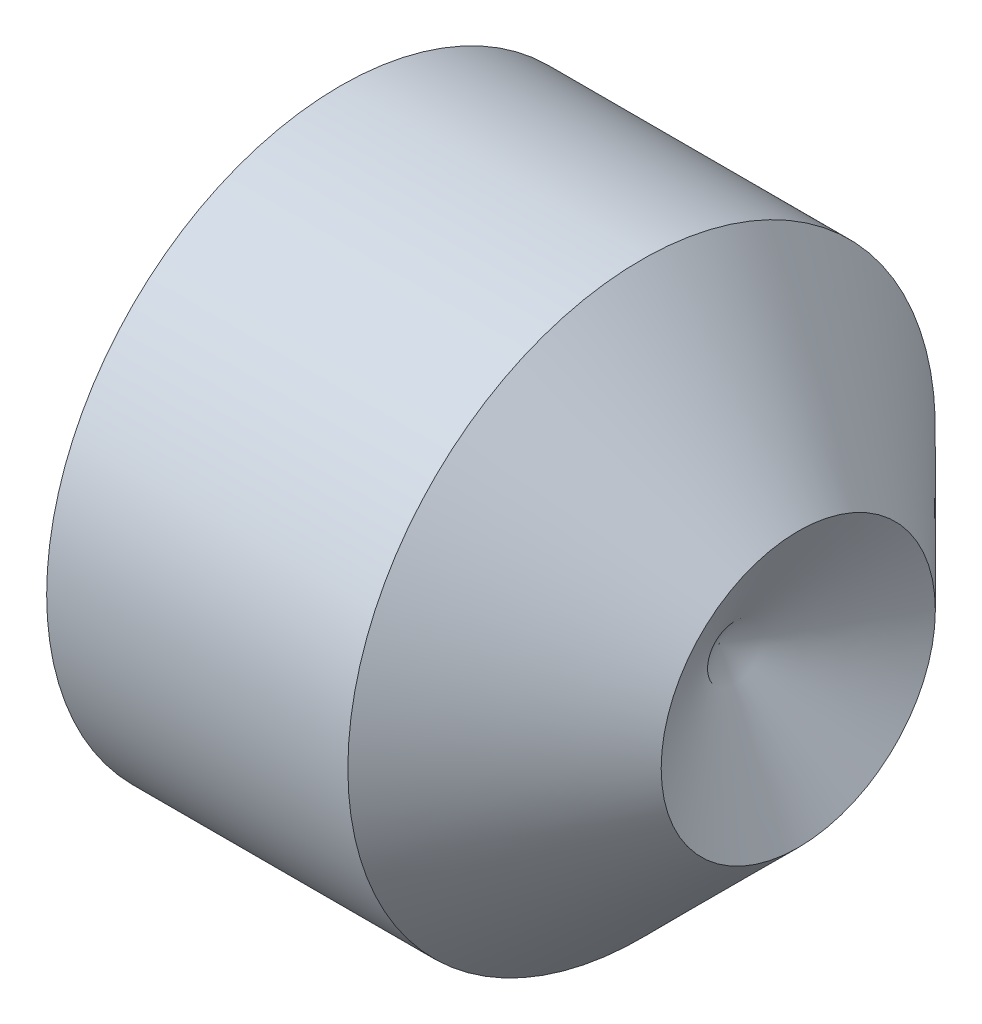
ISO-10303-21;
HEADER;
FILE_DESCRIPTION(('STEP AP214'),'2;1');
FILE_NAME('part.step','',(''),(''),'','','');
FILE_SCHEMA(('AUTOMOTIVE_DESIGN { 1 0 10303 214 1 1 1 1 }'));
ENDSEC;
DATA;
#1=APPLICATION_CONTEXT('core data for automotive mechanical design processes');
#2=APPLICATION_PROTOCOL_DEFINITION('international standard','automotive_design',2000,#1);
#3=PRODUCT_CONTEXT('',#1,'mechanical');
#4=PRODUCT('Part','Part','',(#3));
#5=PRODUCT_RELATED_PRODUCT_CATEGORY('part','',(#4));
#6=PRODUCT_DEFINITION_FORMATION('','',#4);
#7=PRODUCT_DEFINITION_CONTEXT('part definition',#1,'design');
#8=PRODUCT_DEFINITION('design','',#6,#7);
#9=PRODUCT_DEFINITION_SHAPE('','',#8);
#10=(LENGTH_UNIT() NAMED_UNIT(*) SI_UNIT(.MILLI.,.METRE.));
#11=(NAMED_UNIT(*) PLANE_ANGLE_UNIT() SI_UNIT($,.RADIAN.));
#12=(NAMED_UNIT(*) SI_UNIT($,.STERADIAN.) SOLID_ANGLE_UNIT());
#13=UNCERTAINTY_MEASURE_WITH_UNIT(LENGTH_MEASURE(1.E-05),#10,'distance_accuracy_value','');
#14=(GEOMETRIC_REPRESENTATION_CONTEXT(3) GLOBAL_UNCERTAINTY_ASSIGNED_CONTEXT((#13)) GLOBAL_UNIT_ASSIGNED_CONTEXT((#10,
#11,#12)) REPRESENTATION_CONTEXT('',''));
#15=CARTESIAN_POINT('',(0.,0.,0.));
#16=DIRECTION('',(0.,0.,1.));
#17=DIRECTION('',(1.,0.,0.));
#18=AXIS2_PLACEMENT_3D('',#15,#16,#17);
#19=CARTESIAN_POINT('',(0.,0.,0.));
#20=DIRECTION('',(-1.,0.,0.));
#21=DIRECTION('',(0.,0.,1.));
#22=AXIS2_PLACEMENT_3D('',#19,#20,#21);
#23=PLANE('',#22);
#24=CARTESIAN_POINT('',(0.,0.,0.));
#25=DIRECTION('',(-1.,0.,0.));
#26=DIRECTION('',(0.,0.,1.));
#27=AXIS2_PLACEMENT_3D('',#24,#25,#26);
#28=CIRCLE('',#27,1.2195);
#29=CARTESIAN_POINT('',(0.,0.,-1.2195));
#30=VERTEX_POINT('',#29);
#31=EDGE_CURVE('E11',#30,#30,#28,.T.);
#32=ORIENTED_EDGE('',*,*,#31,.T.);
#33=EDGE_LOOP('',(#32));
#34=FACE_BOUND('',#33,.T.);
#35=DIRECTION('',(0.,0.,-1.));
#36=VECTOR('',#35,1.);
#37=CARTESIAN_POINT('',(0.,0.749999999999917,0.433012701892277));
#38=LINE('',#37,#36);
#39=CARTESIAN_POINT('',(0.,0.749999999999917,0.433012701892277));
#40=VERTEX_POINT('',#39);
#41=CARTESIAN_POINT('',(0.,0.749999999999917,-0.433012701892277));
#42=VERTEX_POINT('',#41);
#43=EDGE_CURVE('E99',#40,#42,#38,.T.);
#44=ORIENTED_EDGE('',*,*,#43,.F.);
#45=DIRECTION('',(0.,-0.866025403784439,0.5));
#46=VECTOR('',#45,1.);
#47=CARTESIAN_POINT('',(0.,0.749999999999917,0.433012701892277));
#48=LINE('',#47,#46);
#49=CARTESIAN_POINT('',(0.,0.,0.866025403784443));
#50=VERTEX_POINT('',#49);
#51=EDGE_CURVE('E52',#40,#50,#48,.T.);
#52=ORIENTED_EDGE('',*,*,#51,.T.);
#53=DIRECTION('',(0.,0.866025403784439,0.499999999999999));
#54=VECTOR('',#53,1.);
#55=CARTESIAN_POINT('',(0.,-0.750000000000028,0.433012701892166));
#56=LINE('',#55,#54);
#57=CARTESIAN_POINT('',(0.,-0.750000000000028,0.433012701892166));
#58=VERTEX_POINT('',#57);
#59=EDGE_CURVE('E105',#58,#50,#56,.T.);
#60=ORIENTED_EDGE('',*,*,#59,.F.);
#61=DIRECTION('',(0.,0.,-1.));
#62=VECTOR('',#61,1.);
#63=CARTESIAN_POINT('',(0.,-0.750000000000028,0.433012701892166));
#64=LINE('',#63,#62);
#65=CARTESIAN_POINT('',(0.,-0.750000000000028,-0.433012701892277));
#66=VERTEX_POINT('',#65);
#67=EDGE_CURVE('E125',#58,#66,#64,.T.);
#68=ORIENTED_EDGE('',*,*,#67,.T.);
#69=DIRECTION('',(0.,0.866025403784438,-0.500000000000001));
#70=VECTOR('',#69,1.);
#71=CARTESIAN_POINT('',(0.,-0.750000000000028,-0.433012701892277));
#72=LINE('',#71,#70);
#73=CARTESIAN_POINT('',(0.,0.,-0.866025403784387));
#74=VERTEX_POINT('',#73);
#75=EDGE_CURVE('E128',#66,#74,#72,.T.);
#76=ORIENTED_EDGE('',*,*,#75,.T.);
#77=DIRECTION('',(0.,-0.866025403784438,-0.5));
#78=VECTOR('',#77,1.);
#79=CARTESIAN_POINT('',(0.,0.749999999999917,-0.433012701892277));
#80=LINE('',#79,#78);
#81=EDGE_CURVE('E131',#42,#74,#80,.T.);
#82=ORIENTED_EDGE('',*,*,#81,.F.);
#83=EDGE_LOOP('',(#44,#52,#60,#68,#76,#82));
#84=FACE_BOUND('',#83,.T.);
#85=ADVANCED_FACE('F38',(#34,#84),#23,.T.);
#86=CARTESIAN_POINT('',(0.,0.,0.));
#87=DIRECTION('',(1.,0.,0.));
#88=DIRECTION('',(0.,0.,-1.));
#89=AXIS2_PLACEMENT_3D('',#86,#87,#88);
#90=CONICAL_SURFACE('',#89,1.2195,1.0471975511966);
#91=CARTESIAN_POINT('',(0.161946750507708,0.,0.));
#92=DIRECTION('',(-1.,0.,0.));
#93=DIRECTION('',(0.,0.,1.));
#94=AXIS2_PLACEMENT_3D('',#91,#92,#93);
#95=CIRCLE('',#94,1.5);
#96=CARTESIAN_POINT('',(0.161946750507707,0.,-1.50000000000003));
#97=VERTEX_POINT('',#96);
#98=EDGE_CURVE('E45',#97,#97,#95,.T.);
#99=CARTESIAN_POINT('',(0.161946750507707,0.,-1.50000000000003));
#100=CARTESIAN_POINT('',(0.160259805189919,0.,-1.49707812500003));
#101=CARTESIAN_POINT('',(0.15857285987213,0.,-1.49415625000003));
#102=CARTESIAN_POINT('',(0.155198969236553,0.,-1.48831250000003));
#103=CARTESIAN_POINT('',(0.153512023918764,0.,-1.48539062500003));
#104=CARTESIAN_POINT('',(0.150138133283187,0.,-1.47954687500003));
#105=CARTESIAN_POINT('',(0.148451187965398,0.,-1.47662500000003));
#106=CARTESIAN_POINT('',(0.145077297329821,0.,-1.47078125000003));
#107=CARTESIAN_POINT('',(0.143390352012032,0.,-1.46785937500003));
#108=CARTESIAN_POINT('',(0.140016461376455,0.,-1.46201562500003));
#109=CARTESIAN_POINT('',(0.138329516058667,0.,-1.45909375000003));
#110=CARTESIAN_POINT('',(0.134955625423089,0.,-1.45325000000003));
#111=CARTESIAN_POINT('',(0.133268680105301,0.,-1.45032812500003));
#112=CARTESIAN_POINT('',(0.129894789469723,0.,-1.44448437500002));
#113=CARTESIAN_POINT('',(0.128207844151935,0.,-1.44156250000002));
#114=CARTESIAN_POINT('',(0.124833953516358,0.,-1.43571875000002));
#115=CARTESIAN_POINT('',(0.123147008198569,0.,-1.43279687500002));
#116=CARTESIAN_POINT('',(0.119773117562992,0.,-1.42695312500002));
#117=CARTESIAN_POINT('',(0.118086172245203,0.,-1.42403125000002));
#118=CARTESIAN_POINT('',(0.114712281609626,0.,-1.41818750000002));
#119=CARTESIAN_POINT('',(0.113025336291837,0.,-1.41526562500002));
#120=CARTESIAN_POINT('',(0.10965144565626,0.,-1.40942187500002));
#121=CARTESIAN_POINT('',(0.107964500338471,0.,-1.40650000000002));
#122=CARTESIAN_POINT('',(0.104590609702894,0.,-1.40065625000002));
#123=CARTESIAN_POINT('',(0.102903664385105,0.,-1.39773437500002));
#124=CARTESIAN_POINT('',(0.0995297737495282,0.,-1.39189062500002));
#125=CARTESIAN_POINT('',(0.0978428284317396,0.,-1.38896875000002));
#126=CARTESIAN_POINT('',(0.0944689377961623,0.,-1.38312500000002));
#127=CARTESIAN_POINT('',(0.0927819924783737,0.,-1.38020312500002));
#128=CARTESIAN_POINT('',(0.0894081018427965,0.,-1.37435937500002));
#129=CARTESIAN_POINT('',(0.0877211565250079,0.,-1.37143750000002));
#130=CARTESIAN_POINT('',(0.0843472658894306,0.,-1.36559375000002));
#131=CARTESIAN_POINT('',(0.082660320571642,0.,-1.36267187500002));
#132=CARTESIAN_POINT('',(0.0792864299360648,0.,-1.35682812500001));
#133=CARTESIAN_POINT('',(0.0775994846182761,0.,-1.35390625000001));
#134=CARTESIAN_POINT('',(0.0742255939826989,0.,-1.34806250000001));
#135=CARTESIAN_POINT('',(0.0725386486649103,0.,-1.34514062500001));
#136=CARTESIAN_POINT('',(0.0691647580293331,0.,-1.33929687500001));
#137=CARTESIAN_POINT('',(0.0674778127115444,0.,-1.33637500000001));
#138=CARTESIAN_POINT('',(0.0641039220759672,0.,-1.33053125000001));
#139=CARTESIAN_POINT('',(0.0624169767581786,0.,-1.32760937500001));
#140=CARTESIAN_POINT('',(0.0590430861226013,0.,-1.32176562500001));
#141=CARTESIAN_POINT('',(0.0573561408048127,0.,-1.31884375000001));
#142=CARTESIAN_POINT('',(0.0539822501692355,0.,-1.31300000000001));
#143=CARTESIAN_POINT('',(0.0522953048514468,0.,-1.31007812500001));
#144=CARTESIAN_POINT('',(0.0489214142158696,0.,-1.30423437500001));
#145=CARTESIAN_POINT('',(0.047234468898081,0.,-1.30131250000001));
#146=CARTESIAN_POINT('',(0.0438605782625037,0.,-1.29546875000001));
#147=CARTESIAN_POINT('',(0.0421736329447151,0.,-1.29254687500001));
#148=CARTESIAN_POINT('',(0.0387997423091379,0.,-1.28670312500001));
#149=CARTESIAN_POINT('',(0.0371127969913492,0.,-1.28378125000001));
#150=CARTESIAN_POINT('',(0.033738906355772,0.,-1.27793750000001));
#151=CARTESIAN_POINT('',(0.0320519610379834,0.,-1.27501562500001));
#152=CARTESIAN_POINT('',(0.0286780704024062,0.,-1.269171875));
#153=CARTESIAN_POINT('',(0.0269911250846175,0.,-1.26625));
#154=CARTESIAN_POINT('',(0.0236172344490403,0.,-1.26040625));
#155=CARTESIAN_POINT('',(0.0219302891312517,0.,-1.257484375));
#156=CARTESIAN_POINT('',(0.0185563984956744,0.,-1.251640625));
#157=CARTESIAN_POINT('',(0.0168694531778858,0.,-1.24871875));
#158=CARTESIAN_POINT('',(0.0134955625423086,0.,-1.242875));
#159=CARTESIAN_POINT('',(0.0118086172245199,0.,-1.239953125));
#160=CARTESIAN_POINT('',(0.00843472658894271,0.,-1.234109375));
#161=CARTESIAN_POINT('',(0.00674778127115408,0.,-1.2311875));
#162=CARTESIAN_POINT('',(0.00337389063557681,0.,-1.22534375));
#163=CARTESIAN_POINT('',(0.00168694531778818,0.,-1.222421875));
#164=CARTESIAN_POINT('',(0.,0.,-1.2195));
#165=B_SPLINE_CURVE_WITH_KNOTS('',3,(#99,#100,#101,#102,#103,#104,#105,#106,#107,#108,#109,#110,
#111,#112,#113,#114,#115,#116,#117,#118,#119,#120,#121,#122,#123,#124,#125,#126,#127,#128,#129,
#130,#131,#132,#133,#134,#135,#136,#137,#138,#139,#140,#141,#142,#143,#144,#145,#146,#147,#148,
#149,#150,#151,#152,#153,#154,#155,#156,#157,#158,#159,#160,#161,#162,#163,#164),.UNSPECIFIED.,
.F.,.F.,(4,2,2,2,2,2,2,2,2,2,2,2,2,2,2,2,2,2,2,2,2,2,2,2,2,2,2,2,2,2,2,2,4),(0.,
0.0101216719067317,0.0202433438134635,0.0303650157201952,0.0404866876269271,0.0506083595336589,
0.0607300314403906,0.0708517033471223,0.080973375253854,0.0910950471605858,0.101216719067318,
0.111338390974049,0.121460062880781,0.131581734787513,0.141703406694245,0.151825078600976,
0.161946750507708,0.17206842241444,0.182190094321172,0.192311766227903,0.202433438134635,
0.212555110041367,0.222676781948099,0.23279845385483,0.242920125761562,0.253041797668294,
0.263163469575026,0.273285141481758,0.283406813388489,0.293528485295221,0.303650157201953,
0.313771829108684,0.323893501015416),.UNSPECIFIED.);
#166=EDGE_CURVE('BSEAM151',#97,#30,#165,.T.);
#167=ORIENTED_EDGE('',*,*,#98,.T.);
#168=ORIENTED_EDGE('',*,*,#31,.F.);
#169=ORIENTED_EDGE('',*,*,#166,.T.);
#170=ORIENTED_EDGE('',*,*,#166,.F.);
#171=EDGE_LOOP('',(#167,#169,#168,#170));
#172=FACE_BOUND('',#171,.T.);
#173=ADVANCED_FACE('F151',(#172),#90,.T.);
#174=CARTESIAN_POINT('',(-12.6999999999999,0.,0.));
#175=DIRECTION('',(-1.,0.,0.));
#176=DIRECTION('',(0.,0.,1.));
#177=AXIS2_PLACEMENT_3D('',#174,#175,#176);
#178=CYLINDRICAL_SURFACE('',#177,1.5);
#179=CARTESIAN_POINT('',(1.69999999999999,0.,0.));
#180=DIRECTION('',(-1.,0.,0.));
#181=DIRECTION('',(0.,0.,1.));
#182=AXIS2_PLACEMENT_3D('',#179,#180,#181);
#183=CIRCLE('',#182,1.5);
#184=CARTESIAN_POINT('',(1.69999999999999,0.,1.5));
#185=VERTEX_POINT('',#184);
#186=EDGE_CURVE('E146',#185,#185,#183,.T.);
#187=ORIENTED_EDGE('',*,*,#186,.T.);
#188=EDGE_LOOP('',(#187));
#189=FACE_BOUND('',#188,.T.);
#190=ORIENTED_EDGE('',*,*,#98,.F.);
#191=EDGE_LOOP('',(#190));
#192=FACE_BOUND('',#191,.T.);
#193=ADVANCED_FACE('F154',(#189,#192),#178,.T.);
#194=CARTESIAN_POINT('',(1.69999999999999,0.,0.));
#195=DIRECTION('',(-1.,0.,0.));
#196=DIRECTION('',(0.,0.,1.));
#197=AXIS2_PLACEMENT_3D('',#194,#195,#196);
#198=CONICAL_SURFACE('',#197,1.5,0.78539816339745);
#199=CARTESIAN_POINT('',(2.49999999999997,0.,0.));
#200=DIRECTION('',(-1.,0.,0.));
#201=DIRECTION('',(0.,0.,1.));
#202=AXIS2_PLACEMENT_3D('',#199,#200,#201);
#203=CIRCLE('',#202,0.7);
#204=CARTESIAN_POINT('',(2.49999999999997,0.,0.700000000000015));
#205=VERTEX_POINT('',#204);
#206=EDGE_CURVE('E106',#205,#205,#203,.T.);
#207=CARTESIAN_POINT('',(2.49999999999997,0.,0.700000000000015));
#208=CARTESIAN_POINT('',(2.49166666666664,0.,0.708333333333348));
#209=CARTESIAN_POINT('',(2.48333333333331,0.,0.716666666666681));
#210=CARTESIAN_POINT('',(2.46666666666664,0.,0.733333333333347));
#211=CARTESIAN_POINT('',(2.45833333333331,0.,0.74166666666668));
#212=CARTESIAN_POINT('',(2.44166666666664,0.,0.758333333333347));
#213=CARTESIAN_POINT('',(2.43333333333331,0.,0.76666666666668));
#214=CARTESIAN_POINT('',(2.41666666666664,0.,0.783333333333346));
#215=CARTESIAN_POINT('',(2.40833333333331,0.,0.791666666666679));
#216=CARTESIAN_POINT('',(2.39166666666664,0.,0.808333333333346));
#217=CARTESIAN_POINT('',(2.38333333333331,0.,0.816666666666679));
#218=CARTESIAN_POINT('',(2.36666666666664,0.,0.833333333333345));
#219=CARTESIAN_POINT('',(2.35833333333331,0.,0.841666666666678));
#220=CARTESIAN_POINT('',(2.34166666666665,0.,0.858333333333345));
#221=CARTESIAN_POINT('',(2.33333333333331,0.,0.866666666666678));
#222=CARTESIAN_POINT('',(2.31666666666665,0.,0.883333333333345));
#223=CARTESIAN_POINT('',(2.30833333333331,0.,0.891666666666677));
#224=CARTESIAN_POINT('',(2.29166666666665,0.,0.908333333333344));
#225=CARTESIAN_POINT('',(2.28333333333331,0.,0.916666666666677));
#226=CARTESIAN_POINT('',(2.26666666666665,0.,0.933333333333343));
#227=CARTESIAN_POINT('',(2.25833333333331,0.,0.941666666666676));
#228=CARTESIAN_POINT('',(2.24166666666665,0.,0.958333333333343));
#229=CARTESIAN_POINT('',(2.23333333333331,0.,0.966666666666676));
#230=CARTESIAN_POINT('',(2.21666666666665,0.,0.983333333333342));
#231=CARTESIAN_POINT('',(2.20833333333332,0.,0.991666666666676));
#232=CARTESIAN_POINT('',(2.19166666666665,0.,1.00833333333334));
#233=CARTESIAN_POINT('',(2.18333333333332,0.,1.01666666666668));
#234=CARTESIAN_POINT('',(2.16666666666665,0.,1.03333333333334));
#235=CARTESIAN_POINT('',(2.15833333333332,0.,1.04166666666667));
#236=CARTESIAN_POINT('',(2.14166666666665,0.,1.05833333333334));
#237=CARTESIAN_POINT('',(2.13333333333332,0.,1.06666666666667));
#238=CARTESIAN_POINT('',(2.11666666666665,0.,1.08333333333334));
#239=CARTESIAN_POINT('',(2.10833333333332,0.,1.09166666666667));
#240=CARTESIAN_POINT('',(2.09166666666665,0.,1.10833333333334));
#241=CARTESIAN_POINT('',(2.08333333333332,0.,1.11666666666667));
#242=CARTESIAN_POINT('',(2.06666666666665,0.,1.13333333333334));
#243=CARTESIAN_POINT('',(2.05833333333332,0.,1.14166666666667));
#244=CARTESIAN_POINT('',(2.04166666666665,0.,1.15833333333334));
#245=CARTESIAN_POINT('',(2.03333333333332,0.,1.16666666666667));
#246=CARTESIAN_POINT('',(2.01666666666665,0.,1.18333333333334));
#247=CARTESIAN_POINT('',(2.00833333333332,0.,1.19166666666667));
#248=CARTESIAN_POINT('',(1.99166666666665,0.,1.20833333333334));
#249=CARTESIAN_POINT('',(1.98333333333332,0.,1.21666666666667));
#250=CARTESIAN_POINT('',(1.96666666666665,0.,1.23333333333334));
#251=CARTESIAN_POINT('',(1.95833333333332,0.,1.24166666666667));
#252=CARTESIAN_POINT('',(1.94166666666665,0.,1.25833333333334));
#253=CARTESIAN_POINT('',(1.93333333333332,0.,1.26666666666667));
#254=CARTESIAN_POINT('',(1.91666666666666,0.,1.28333333333334));
#255=CARTESIAN_POINT('',(1.90833333333332,0.,1.29166666666667));
#256=CARTESIAN_POINT('',(1.89166666666666,0.,1.30833333333334));
#257=CARTESIAN_POINT('',(1.88333333333332,0.,1.31666666666667));
#258=CARTESIAN_POINT('',(1.86666666666666,0.,1.33333333333334));
#259=CARTESIAN_POINT('',(1.85833333333332,0.,1.34166666666667));
#260=CARTESIAN_POINT('',(1.84166666666666,0.,1.35833333333334));
#261=CARTESIAN_POINT('',(1.83333333333332,0.,1.36666666666667));
#262=CARTESIAN_POINT('',(1.81666666666666,0.,1.38333333333333));
#263=CARTESIAN_POINT('',(1.80833333333332,0.,1.39166666666667));
#264=CARTESIAN_POINT('',(1.79166666666666,0.,1.40833333333333));
#265=CARTESIAN_POINT('',(1.78333333333332,0.,1.41666666666667));
#266=CARTESIAN_POINT('',(1.76666666666666,0.,1.43333333333333));
#267=CARTESIAN_POINT('',(1.75833333333333,0.,1.44166666666667));
#268=CARTESIAN_POINT('',(1.74166666666666,0.,1.45833333333333));
#269=CARTESIAN_POINT('',(1.73333333333333,0.,1.46666666666667));
#270=CARTESIAN_POINT('',(1.71666666666666,0.,1.48333333333333));
#271=CARTESIAN_POINT('',(1.70833333333333,0.,1.49166666666667));
#272=CARTESIAN_POINT('',(1.69999999999999,0.,1.5));
#273=B_SPLINE_CURVE_WITH_KNOTS('',3,(#207,#208,#209,#210,#211,#212,#213,#214,#215,#216,#217,
#218,#219,#220,#221,#222,#223,#224,#225,#226,#227,#228,#229,#230,#231,#232,#233,#234,#235,#236,
#237,#238,#239,#240,#241,#242,#243,#244,#245,#246,#247,#248,#249,#250,#251,#252,#253,#254,#255,
#256,#257,#258,#259,#260,#261,#262,#263,#264,#265,#266,#267,#268,#269,#270,#271,#272),
.UNSPECIFIED.,.F.,.F.,(4,2,2,2,2,2,2,2,2,2,2,2,2,2,2,2,2,2,2,2,2,2,2,2,2,2,2,2,2,2,2,2,4),(0.,
0.0353553390593262,0.0707106781186532,0.10606601717798,0.141421356237306,0.176776695296633,
0.21213203435596,0.247487373415286,0.282842712474613,0.318198051533939,0.353553390593266,
0.388908729652592,0.424264068711919,0.459619407771245,0.494974746830572,0.530330085889899,
0.565685424949225,0.601040764008552,0.636396103067878,0.671751442127205,0.707106781186532,
0.742462120245858,0.777817459305185,0.813172798364512,0.848528137423838,0.883883476483165,
0.919238815542491,0.954594154601818,0.989949493661145,1.02530483272047,1.0606601717798,
1.09601551083912,1.13137084989845),.UNSPECIFIED.);
#274=EDGE_CURVE('BSEAM156',#205,#185,#273,.T.);
#275=ORIENTED_EDGE('',*,*,#206,.T.);
#276=ORIENTED_EDGE('',*,*,#186,.F.);
#277=ORIENTED_EDGE('',*,*,#274,.T.);
#278=ORIENTED_EDGE('',*,*,#274,.F.);
#279=EDGE_LOOP('',(#275,#277,#276,#278));
#280=FACE_BOUND('',#279,.T.);
#281=ADVANCED_FACE('F156',(#280),#198,.T.);
#282=CARTESIAN_POINT('',(2.0958548115672,0.,0.));
#283=DIRECTION('',(1.,0.,0.));
#284=DIRECTION('',(0.,0.,-1.));
#285=AXIS2_PLACEMENT_3D('',#282,#283,#284);
#286=CONICAL_SURFACE('',#285,0.,1.0471975511966);
#287=ORIENTED_EDGE('',*,*,#206,.F.);
#288=EDGE_LOOP('',(#287));
#289=FACE_BOUND('',#288,.T.);
#290=CARTESIAN_POINT('',(2.0958548115672,0.,0.));
#291=VERTEX_POINT('',#290);
#292=VERTEX_LOOP('',#291);
#293=FACE_BOUND('',#292,.T.);
#294=ADVANCED_FACE('F163',(#289,#293),#286,.F.);
#295=CARTESIAN_POINT('',(1.1999999999999,0.749999999999917,0.433012701892166));
#296=DIRECTION('',(0.,-0.5,-0.866025403784438));
#297=DIRECTION('',(0.,0.866025403784438,-0.5));
#298=AXIS2_PLACEMENT_3D('',#295,#296,#297);
#299=PLANE('',#298);
#300=ORIENTED_EDGE('',*,*,#51,.F.);
#301=DIRECTION('',(-1.,0.,0.));
#302=VECTOR('',#301,1.);
#303=CARTESIAN_POINT('',(1.1999999999999,0.749999999999917,0.433012701892166));
#304=LINE('',#303,#302);
#305=CARTESIAN_POINT('',(1.1999999999999,0.749999999999917,0.433012701892166));
#306=VERTEX_POINT('',#305);
#307=EDGE_CURVE('E93',#306,#40,#304,.T.);
#308=ORIENTED_EDGE('',*,*,#307,.F.);
#309=DIRECTION('',(0.,-0.866025403784439,0.5));
#310=VECTOR('',#309,1.);
#311=CARTESIAN_POINT('',(1.1999999999999,0.749999999999917,0.433012701892166));
#312=LINE('',#311,#310);
#313=CARTESIAN_POINT('',(1.19999999999998,0.,0.866025403784498));
#314=VERTEX_POINT('',#313);
#315=EDGE_CURVE('E88',#306,#314,#312,.T.);
#316=ORIENTED_EDGE('',*,*,#315,.T.);
#317=DIRECTION('',(-1.,0.,0.));
#318=VECTOR('',#317,1.);
#319=CARTESIAN_POINT('',(1.19999999999998,0.,0.866025403784498));
#320=LINE('',#319,#318);
#321=EDGE_CURVE('E91',#314,#50,#320,.T.);
#322=ORIENTED_EDGE('',*,*,#321,.T.);
#323=EDGE_LOOP('',(#300,#308,#316,#322));
#324=FACE_BOUND('',#323,.T.);
#325=ADVANCED_FACE('F90',(#324),#299,.T.);
#326=CARTESIAN_POINT('',(1.19999999999998,-0.750000000000028,0.43301270189211));
#327=DIRECTION('',(0.,-0.5,0.866025403784439));
#328=DIRECTION('',(0.,-0.866025403784439,-0.5));
#329=AXIS2_PLACEMENT_3D('',#326,#327,#328);
#330=PLANE('',#329);
#331=ORIENTED_EDGE('',*,*,#59,.T.);
#332=ORIENTED_EDGE('',*,*,#321,.F.);
#333=DIRECTION('',(0.,0.866025403784439,0.499999999999999));
#334=VECTOR('',#333,1.);
#335=CARTESIAN_POINT('',(1.19999999999998,-0.750000000000028,0.43301270189211));
#336=LINE('',#335,#334);
#337=CARTESIAN_POINT('',(1.19999999999998,-0.750000000000028,0.43301270189211));
#338=VERTEX_POINT('',#337);
#339=EDGE_CURVE('E98',#338,#314,#336,.T.);
#340=ORIENTED_EDGE('',*,*,#339,.F.);
#341=DIRECTION('',(-1.,0.,0.));
#342=VECTOR('',#341,1.);
#343=CARTESIAN_POINT('',(1.19999999999998,-0.750000000000028,0.43301270189211));
#344=LINE('',#343,#342);
#345=EDGE_CURVE('E107',#338,#58,#344,.T.);
#346=ORIENTED_EDGE('',*,*,#345,.T.);
#347=EDGE_LOOP('',(#331,#332,#340,#346));
#348=FACE_BOUND('',#347,.T.);
#349=ADVANCED_FACE('F103',(#348),#330,.F.);
#350=CARTESIAN_POINT('',(1.19999999999998,-0.750000000000028,0.43301270189211));
#351=DIRECTION('',(0.,1.,0.));
#352=DIRECTION('',(0.,0.,1.));
#353=AXIS2_PLACEMENT_3D('',#350,#351,#352);
#354=PLANE('',#353);
#355=ORIENTED_EDGE('',*,*,#67,.F.);
#356=ORIENTED_EDGE('',*,*,#345,.F.);
#357=DIRECTION('',(0.,0.,-1.));
#358=VECTOR('',#357,1.);
#359=CARTESIAN_POINT('',(1.19999999999998,-0.750000000000028,0.43301270189211));
#360=LINE('',#359,#358);
#361=CARTESIAN_POINT('',(1.20000000000003,-0.750000000000028,-0.433012701892388));
#362=VERTEX_POINT('',#361);
#363=EDGE_CURVE('E112',#338,#362,#360,.T.);
#364=ORIENTED_EDGE('',*,*,#363,.T.);
#365=DIRECTION('',(-1.,0.,0.));
#366=VECTOR('',#365,1.);
#367=CARTESIAN_POINT('',(1.20000000000003,-0.750000000000028,-0.433012701892388));
#368=LINE('',#367,#366);
#369=EDGE_CURVE('E141',#362,#66,#368,.T.);
#370=ORIENTED_EDGE('',*,*,#369,.T.);
#371=EDGE_LOOP('',(#355,#356,#364,#370));
#372=FACE_BOUND('',#371,.T.);
#373=ADVANCED_FACE('F186',(#372),#354,.T.);
#374=CARTESIAN_POINT('',(1.20000000000003,-0.750000000000028,-0.433012701892388));
#375=DIRECTION('',(0.,0.5,0.866025403784438));
#376=DIRECTION('',(0.,-0.866025403784438,0.500000000000001));
#377=AXIS2_PLACEMENT_3D('',#374,#375,#376);
#378=PLANE('',#377);
#379=ORIENTED_EDGE('',*,*,#75,.F.);
#380=ORIENTED_EDGE('',*,*,#369,.F.);
#381=DIRECTION('',(0.,0.866025403784438,-0.500000000000001));
#382=VECTOR('',#381,1.);
#383=CARTESIAN_POINT('',(1.20000000000003,-0.750000000000028,-0.433012701892388));
#384=LINE('',#383,#382);
#385=CARTESIAN_POINT('',(1.19999999999998,0.,-0.866025403784443));
#386=VERTEX_POINT('',#385);
#387=EDGE_CURVE('E114',#362,#386,#384,.T.);
#388=ORIENTED_EDGE('',*,*,#387,.T.);
#389=DIRECTION('',(-1.,0.,0.));
#390=VECTOR('',#389,1.);
#391=CARTESIAN_POINT('',(1.19999999999998,0.,-0.866025403784443));
#392=LINE('',#391,#390);
#393=EDGE_CURVE('E139',#386,#74,#392,.T.);
#394=ORIENTED_EDGE('',*,*,#393,.T.);
#395=EDGE_LOOP('',(#379,#380,#388,#394));
#396=FACE_BOUND('',#395,.T.);
#397=ADVANCED_FACE('F182',(#396),#378,.T.);
#398=CARTESIAN_POINT('',(1.20000000000003,0.749999999999862,-0.433012701892332));
#399=DIRECTION('',(0.,0.5,-0.866025403784439));
#400=DIRECTION('',(0.,0.866025403784439,0.5));
#401=AXIS2_PLACEMENT_3D('',#398,#399,#400);
#402=PLANE('',#401);
#403=ORIENTED_EDGE('',*,*,#81,.T.);
#404=ORIENTED_EDGE('',*,*,#393,.F.);
#405=DIRECTION('',(0.,-0.866025403784438,-0.5));
#406=VECTOR('',#405,1.);
#407=CARTESIAN_POINT('',(1.20000000000003,0.749999999999862,-0.433012701892332));
#408=LINE('',#407,#406);
#409=CARTESIAN_POINT('',(1.20000000000003,0.749999999999862,-0.433012701892332));
#410=VERTEX_POINT('',#409);
#411=EDGE_CURVE('E118',#410,#386,#408,.T.);
#412=ORIENTED_EDGE('',*,*,#411,.F.);
#413=DIRECTION('',(-1.,0.,0.));
#414=VECTOR('',#413,1.);
#415=CARTESIAN_POINT('',(1.20000000000003,0.749999999999862,-0.433012701892332));
#416=LINE('',#415,#414);
#417=EDGE_CURVE('E137',#410,#42,#416,.T.);
#418=ORIENTED_EDGE('',*,*,#417,.T.);
#419=EDGE_LOOP('',(#403,#404,#412,#418));
#420=FACE_BOUND('',#419,.T.);
#421=ADVANCED_FACE('F179',(#420),#402,.F.);
#422=CARTESIAN_POINT('',(1.1999999999999,0.749999999999917,0.433012701892166));
#423=DIRECTION('',(0.,1.,0.));
#424=DIRECTION('',(0.,0.,1.));
#425=AXIS2_PLACEMENT_3D('',#422,#423,#424);
#426=PLANE('',#425);
#427=ORIENTED_EDGE('',*,*,#43,.T.);
#428=ORIENTED_EDGE('',*,*,#417,.F.);
#429=DIRECTION('',(0.,0.,-1.));
#430=VECTOR('',#429,1.);
#431=CARTESIAN_POINT('',(1.1999999999999,0.749999999999917,0.433012701892166));
#432=LINE('',#431,#430);
#433=EDGE_CURVE('E121',#306,#410,#432,.T.);
#434=ORIENTED_EDGE('',*,*,#433,.F.);
#435=ORIENTED_EDGE('',*,*,#307,.T.);
#436=EDGE_LOOP('',(#427,#428,#434,#435));
#437=FACE_BOUND('',#436,.T.);
#438=ADVANCED_FACE('F175',(#437),#426,.F.);
#439=CARTESIAN_POINT('',(1.19999999999998,1.50000000000003,0.));
#440=DIRECTION('',(1.,0.,0.));
#441=DIRECTION('',(0.,0.,-1.));
#442=AXIS2_PLACEMENT_3D('',#439,#440,#441);
#443=PLANE('',#442);
#444=ORIENTED_EDGE('',*,*,#315,.F.);
#445=ORIENTED_EDGE('',*,*,#433,.T.);
#446=ORIENTED_EDGE('',*,*,#411,.T.);
#447=ORIENTED_EDGE('',*,*,#387,.F.);
#448=ORIENTED_EDGE('',*,*,#363,.F.);
#449=ORIENTED_EDGE('',*,*,#339,.T.);
#450=EDGE_LOOP('',(#444,#445,#446,#447,#448,#449));
#451=FACE_BOUND('',#450,.T.);
#452=ADVANCED_FACE('F110',(#451),#443,.F.);
#453=CLOSED_SHELL('',(#85,#173,#193,#281,#294,#325,#349,#373,#397,#421,#438,#452));
#454=MANIFOLD_SOLID_BREP('B2',#453);
#455=ADVANCED_BREP_SHAPE_REPRESENTATION('',(#18,#454),#14);
#456=SHAPE_DEFINITION_REPRESENTATION(#9,#455);
ENDSEC;
END-ISO-10303-21;
